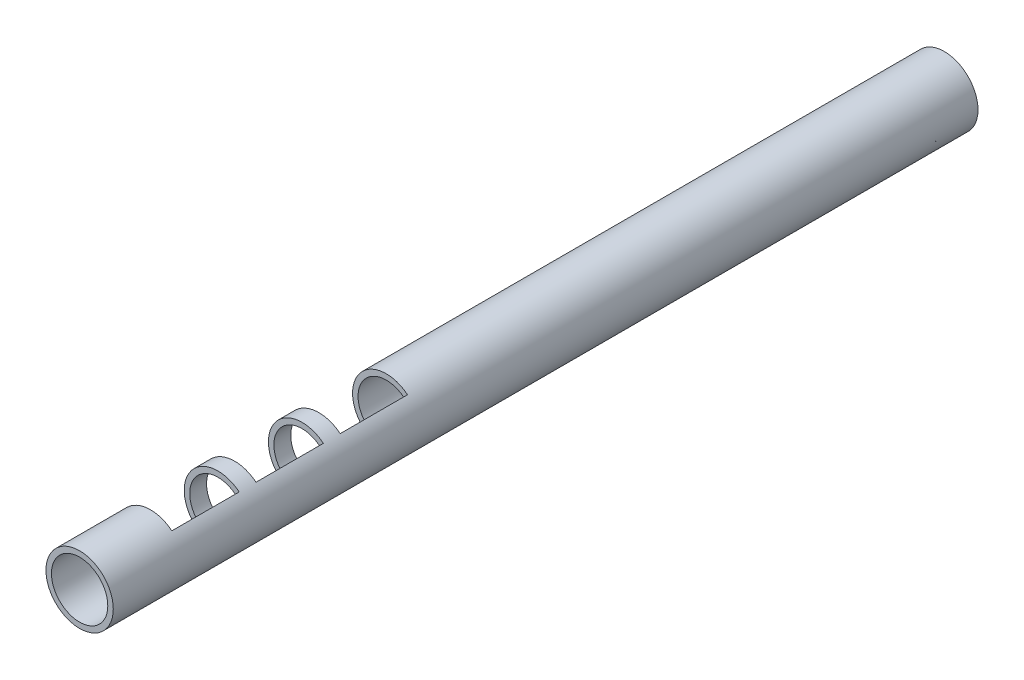
ISO-10303-21;
HEADER;
FILE_DESCRIPTION(('STEP AP214'),'2;1');
FILE_NAME('part.step','',(''),(''),'','','');
FILE_SCHEMA(('AUTOMOTIVE_DESIGN { 1 0 10303 214 1 1 1 1 }'));
ENDSEC;
DATA;
#1=APPLICATION_CONTEXT('core data for automotive mechanical design processes');
#2=APPLICATION_PROTOCOL_DEFINITION('international standard','automotive_design',2000,#1);
#3=PRODUCT_CONTEXT('',#1,'mechanical');
#4=PRODUCT('Part','Part','',(#3));
#5=PRODUCT_RELATED_PRODUCT_CATEGORY('part','',(#4));
#6=PRODUCT_DEFINITION_FORMATION('','',#4);
#7=PRODUCT_DEFINITION_CONTEXT('part definition',#1,'design');
#8=PRODUCT_DEFINITION('design','',#6,#7);
#9=PRODUCT_DEFINITION_SHAPE('','',#8);
#10=(LENGTH_UNIT() NAMED_UNIT(*) SI_UNIT(.MILLI.,.METRE.));
#11=(NAMED_UNIT(*) PLANE_ANGLE_UNIT() SI_UNIT($,.RADIAN.));
#12=(NAMED_UNIT(*) SI_UNIT($,.STERADIAN.) SOLID_ANGLE_UNIT());
#13=UNCERTAINTY_MEASURE_WITH_UNIT(LENGTH_MEASURE(1.E-05),#10,'distance_accuracy_value','');
#14=(GEOMETRIC_REPRESENTATION_CONTEXT(3) GLOBAL_UNCERTAINTY_ASSIGNED_CONTEXT((#13)) GLOBAL_UNIT_ASSIGNED_CONTEXT((#10,
#11,#12)) REPRESENTATION_CONTEXT('',''));
#15=CARTESIAN_POINT('',(0.,0.,0.));
#16=DIRECTION('',(0.,0.,1.));
#17=DIRECTION('',(1.,0.,0.));
#18=AXIS2_PLACEMENT_3D('',#15,#16,#17);
#19=CARTESIAN_POINT('',(0.393200000000001,0.481952030808046,2.488));
#20=DIRECTION('',(-0.774842493260524,0.632154340836013,0.));
#21=DIRECTION('',(0.,0.,1.));
#22=AXIS2_PLACEMENT_3D('',#19,#20,#21);
#23=PLANE('',#22);
#24=DIRECTION('',(0.632154340836013,0.774842493260524,0.));
#25=VECTOR('',#24,1.);
#26=CARTESIAN_POINT('',(0.393200000000001,0.481952030808046,1.866));
#27=LINE('',#26,#25);
#28=CARTESIAN_POINT('',(0.329108400000001,0.403393849786335,1.866));
#29=VERTEX_POINT('',#28);
#30=CARTESIAN_POINT('',(0.393200000000001,0.481952030808046,1.866));
#31=VERTEX_POINT('',#30);
#32=EDGE_CURVE('E11',#29,#31,#27,.T.);
#33=ORIENTED_EDGE('',*,*,#32,.F.);
#34=DIRECTION('',(0.,0.,1.));
#35=VECTOR('',#34,1.);
#36=CARTESIAN_POINT('',(0.329108400000001,0.403393849786335,1.555));
#37=LINE('',#36,#35);
#38=CARTESIAN_POINT('',(0.329108400000001,0.403393849786335,3.11));
#39=VERTEX_POINT('',#38);
#40=EDGE_CURVE('E296',#29,#39,#37,.T.);
#41=ORIENTED_EDGE('',*,*,#40,.T.);
#42=DIRECTION('',(0.632154340836013,0.774842493260524,0.));
#43=VECTOR('',#42,1.);
#44=CARTESIAN_POINT('',(0.393200000000001,0.481952030808046,3.11));
#45=LINE('',#44,#43);
#46=CARTESIAN_POINT('',(0.393200000000001,0.481952030808046,3.11));
#47=VERTEX_POINT('',#46);
#48=EDGE_CURVE('E51',#39,#47,#45,.T.);
#49=ORIENTED_EDGE('',*,*,#48,.T.);
#50=DIRECTION('',(0.,0.,1.));
#51=VECTOR('',#50,1.);
#52=CARTESIAN_POINT('',(0.393200000000001,0.481952030808046,1.555));
#53=LINE('',#52,#51);
#54=EDGE_CURVE('E286',#31,#47,#53,.T.);
#55=ORIENTED_EDGE('',*,*,#54,.F.);
#56=EDGE_LOOP('',(#33,#41,#49,#55));
#57=FACE_BOUND('',#56,.T.);
#58=ADVANCED_FACE('F43',(#57),#23,.T.);
#59=CARTESIAN_POINT('',(0.,0.,3.11));
#60=DIRECTION('',(0.,0.,1.));
#61=DIRECTION('',(1.,0.,0.));
#62=AXIS2_PLACEMENT_3D('',#59,#60,#61);
#63=PLANE('',#62);
#64=ORIENTED_EDGE('',*,*,#48,.F.);
#65=CARTESIAN_POINT('',(0.,0.,3.11));
#66=DIRECTION('',(0.,0.,1.));
#67=DIRECTION('',(1.,0.,0.));
#68=AXIS2_PLACEMENT_3D('',#65,#66,#67);
#69=CIRCLE('',#68,0.520614);
#70=CARTESIAN_POINT('',(0.329108400000001,-0.403393849786335,3.11));
#71=VERTEX_POINT('',#70);
#72=EDGE_CURVE('E293',#39,#71,#69,.T.);
#73=ORIENTED_EDGE('',*,*,#72,.T.);
#74=DIRECTION('',(0.632154340836013,-0.774842493260524,0.));
#75=VECTOR('',#74,1.);
#76=CARTESIAN_POINT('',(0.3932,-0.481952030808046,3.11));
#77=LINE('',#76,#75);
#78=CARTESIAN_POINT('',(0.3932,-0.481952030808046,3.11));
#79=VERTEX_POINT('',#78);
#80=EDGE_CURVE('E176',#71,#79,#77,.T.);
#81=ORIENTED_EDGE('',*,*,#80,.T.);
#82=CARTESIAN_POINT('',(0.,0.,3.11));
#83=DIRECTION('',(0.,0.,-1.));
#84=DIRECTION('',(-1.,0.,0.));
#85=AXIS2_PLACEMENT_3D('',#82,#83,#84);
#86=CIRCLE('',#85,0.622);
#87=EDGE_CURVE('E281',#47,#79,#86,.F.);
#88=ORIENTED_EDGE('',*,*,#87,.F.);
#89=EDGE_LOOP('',(#64,#73,#81,#88));
#90=FACE_BOUND('',#89,.T.);
#91=ADVANCED_FACE('F241',(#90),#63,.F.);
#92=CARTESIAN_POINT('',(0.,0.,3.421));
#93=DIRECTION('',(0.,0.,-1.));
#94=DIRECTION('',(-1.,0.,0.));
#95=AXIS2_PLACEMENT_3D('',#92,#93,#94);
#96=PLANE('',#95);
#97=DIRECTION('',(0.632154340836013,0.774842493260524,0.));
#98=VECTOR('',#97,1.);
#99=CARTESIAN_POINT('',(0.393200000000001,0.481952030808046,3.421));
#100=LINE('',#99,#98);
#101=CARTESIAN_POINT('',(0.329108400000001,0.403393849786335,3.421));
#102=VERTEX_POINT('',#101);
#103=CARTESIAN_POINT('',(0.393200000000001,0.481952030808046,3.421));
#104=VERTEX_POINT('',#103);
#105=EDGE_CURVE('E268',#102,#104,#100,.T.);
#106=ORIENTED_EDGE('',*,*,#105,.T.);
#107=CARTESIAN_POINT('',(0.,0.,3.421));
#108=DIRECTION('',(0.,0.,1.));
#109=DIRECTION('',(1.,0.,0.));
#110=AXIS2_PLACEMENT_3D('',#107,#108,#109);
#111=CIRCLE('',#110,0.622);
#112=CARTESIAN_POINT('',(0.393200000000001,-0.481952030808046,3.421));
#113=VERTEX_POINT('',#112);
#114=EDGE_CURVE('E282',#104,#113,#111,.T.);
#115=ORIENTED_EDGE('',*,*,#114,.T.);
#116=DIRECTION('',(0.632154340836013,-0.774842493260524,0.));
#117=VECTOR('',#116,1.);
#118=CARTESIAN_POINT('',(0.393200000000001,-0.481952030808046,3.421));
#119=LINE('',#118,#117);
#120=CARTESIAN_POINT('',(0.329108400000001,-0.403393849786335,3.421));
#121=VERTEX_POINT('',#120);
#122=EDGE_CURVE('E152',#121,#113,#119,.T.);
#123=ORIENTED_EDGE('',*,*,#122,.F.);
#124=CARTESIAN_POINT('',(0.,0.,3.421));
#125=DIRECTION('',(0.,0.,1.));
#126=DIRECTION('',(1.,0.,0.));
#127=AXIS2_PLACEMENT_3D('',#124,#125,#126);
#128=CIRCLE('',#127,0.520614);
#129=EDGE_CURVE('E279',#102,#121,#128,.T.);
#130=ORIENTED_EDGE('',*,*,#129,.F.);
#131=EDGE_LOOP('',(#106,#115,#123,#130));
#132=FACE_BOUND('',#131,.T.);
#133=ADVANCED_FACE('F246',(#132),#96,.F.);
#134=CARTESIAN_POINT('',(0.,0.,1.555));
#135=DIRECTION('',(0.,0.,-1.));
#136=DIRECTION('',(-1.,0.,0.));
#137=AXIS2_PLACEMENT_3D('',#134,#135,#136);
#138=PLANE('',#137);
#139=DIRECTION('',(0.632154340836013,0.774842493260524,0.));
#140=VECTOR('',#139,1.);
#141=CARTESIAN_POINT('',(0.3932,0.481952030808046,1.555));
#142=LINE('',#141,#140);
#143=CARTESIAN_POINT('',(0.3291084,0.403393849786335,1.555));
#144=VERTEX_POINT('',#143);
#145=CARTESIAN_POINT('',(0.3932,0.481952030808046,1.555));
#146=VERTEX_POINT('',#145);
#147=EDGE_CURVE('E255',#144,#146,#142,.T.);
#148=ORIENTED_EDGE('',*,*,#147,.F.);
#149=CARTESIAN_POINT('',(0.,0.,1.555));
#150=DIRECTION('',(0.,0.,1.));
#151=DIRECTION('',(1.,0.,0.));
#152=AXIS2_PLACEMENT_3D('',#149,#150,#151);
#153=CIRCLE('',#152,0.520614);
#154=CARTESIAN_POINT('',(0.3291084,-0.403393849786335,1.555));
#155=VERTEX_POINT('',#154);
#156=EDGE_CURVE('E257',#144,#155,#153,.T.);
#157=ORIENTED_EDGE('',*,*,#156,.T.);
#158=DIRECTION('',(0.632154340836013,-0.774842493260524,0.));
#159=VECTOR('',#158,1.);
#160=CARTESIAN_POINT('',(0.3932,-0.481952030808046,1.555));
#161=LINE('',#160,#159);
#162=CARTESIAN_POINT('',(0.3932,-0.481952030808046,1.555));
#163=VERTEX_POINT('',#162);
#164=EDGE_CURVE('E165',#155,#163,#161,.T.);
#165=ORIENTED_EDGE('',*,*,#164,.T.);
#166=CARTESIAN_POINT('',(0.,0.,1.555));
#167=DIRECTION('',(0.,0.,1.));
#168=DIRECTION('',(1.,0.,0.));
#169=AXIS2_PLACEMENT_3D('',#166,#167,#168);
#170=CIRCLE('',#169,0.622);
#171=EDGE_CURVE('E66',#146,#163,#170,.T.);
#172=ORIENTED_EDGE('',*,*,#171,.F.);
#173=EDGE_LOOP('',(#148,#157,#165,#172));
#174=FACE_BOUND('',#173,.T.);
#175=ADVANCED_FACE('F237',(#174),#138,.T.);
#176=CARTESIAN_POINT('',(0.,0.,1.866));
#177=DIRECTION('',(0.,0.,-1.));
#178=DIRECTION('',(-1.,0.,0.));
#179=AXIS2_PLACEMENT_3D('',#176,#177,#178);
#180=PLANE('',#179);
#181=CARTESIAN_POINT('',(0.,0.,1.866));
#182=DIRECTION('',(0.,0.,1.));
#183=DIRECTION('',(1.,0.,0.));
#184=AXIS2_PLACEMENT_3D('',#181,#182,#183);
#185=CIRCLE('',#184,0.520614);
#186=CARTESIAN_POINT('',(0.329108400000001,-0.403393849786335,1.866));
#187=VERTEX_POINT('',#186);
#188=EDGE_CURVE('E284',#187,#29,#185,.F.);
#189=ORIENTED_EDGE('',*,*,#188,.T.);
#190=ORIENTED_EDGE('',*,*,#32,.T.);
#191=CARTESIAN_POINT('',(0.,0.,1.866));
#192=DIRECTION('',(0.,0.,1.));
#193=DIRECTION('',(1.,0.,0.));
#194=AXIS2_PLACEMENT_3D('',#191,#192,#193);
#195=CIRCLE('',#194,0.622);
#196=CARTESIAN_POINT('',(0.3932,-0.481952030808046,1.866));
#197=VERTEX_POINT('',#196);
#198=EDGE_CURVE('E289',#197,#31,#195,.F.);
#199=ORIENTED_EDGE('',*,*,#198,.F.);
#200=DIRECTION('',(0.632154340836013,-0.774842493260524,0.));
#201=VECTOR('',#200,1.);
#202=CARTESIAN_POINT('',(0.3932,-0.481952030808046,1.866));
#203=LINE('',#202,#201);
#204=EDGE_CURVE('E181',#187,#197,#203,.T.);
#205=ORIENTED_EDGE('',*,*,#204,.F.);
#206=EDGE_LOOP('',(#189,#190,#199,#205));
#207=FACE_BOUND('',#206,.T.);
#208=ADVANCED_FACE('F45',(#207),#180,.F.);
#209=CARTESIAN_POINT('',(0.,0.,1.555));
#210=DIRECTION('',(0.,0.,1.));
#211=DIRECTION('',(1.,0.,0.));
#212=AXIS2_PLACEMENT_3D('',#209,#210,#211);
#213=CYLINDRICAL_SURFACE('',#212,0.622);
#214=CARTESIAN_POINT('',(-0.622,0.,5.365));
#215=CARTESIAN_POINT('',(-0.621999577929827,0.0109193633288384,5.36499939308507));
#216=CARTESIAN_POINT('',(-0.621709329938002,0.0218502270294628,5.36410161503432));
#217=CARTESIAN_POINT('',(-0.620578112855119,0.043402443202015,5.36054010866013));
#218=CARTESIAN_POINT('',(-0.619736207669612,0.0540232374685384,5.35787337854731));
#219=CARTESIAN_POINT('',(-0.617593869971351,0.0746246518911457,5.35087419082279));
#220=CARTESIAN_POINT('',(-0.61629445041236,0.0846066291781811,5.34654541114978));
#221=CARTESIAN_POINT('',(-0.613370888019472,0.103699386181399,5.33635803819557));
#222=CARTESIAN_POINT('',(-0.61174679129765,0.112810289340036,5.33049966211826));
#223=CARTESIAN_POINT('',(-0.608286102372987,0.130203719158426,5.31721765206123));
#224=CARTESIAN_POINT('',(-0.606444663928166,0.138453985198494,5.30975303528527));
#225=CARTESIAN_POINT('',(-0.602784240920798,0.153610144329198,5.29355730894605));
#226=CARTESIAN_POINT('',(-0.600965262165017,0.160515696300347,5.28482587900247));
#227=CARTESIAN_POINT('',(-0.597503530771228,0.172963818804697,5.26606209326497));
#228=CARTESIAN_POINT('',(-0.595866696764658,0.178465603211153,5.25600148309368));
#229=CARTESIAN_POINT('',(-0.59302745289626,0.187685596399211,5.23503670826931));
#230=CARTESIAN_POINT('',(-0.591824918677886,0.191404315840203,5.22413278617599));
#231=CARTESIAN_POINT('',(-0.590041030843826,0.196833859126492,5.20215455937567));
#232=CARTESIAN_POINT('',(-0.589441214579351,0.198604530142794,5.19109658086054));
#233=CARTESIAN_POINT('',(-0.588875945894283,0.200274737992444,5.16882547613999));
#234=CARTESIAN_POINT('',(-0.588910313539342,0.200174805564169,5.15761239484344));
#235=CARTESIAN_POINT('',(-0.589593281584499,0.198153311328795,5.13585096574481));
#236=CARTESIAN_POINT('',(-0.590215937903085,0.196308688318,5.12529451770902));
#237=CARTESIAN_POINT('',(-0.591963052928186,0.190975230611652,5.10464966713253));
#238=CARTESIAN_POINT('',(-0.593087570309906,0.187486203657547,5.09456131947219));
#239=CARTESIAN_POINT('',(-0.595731017518543,0.178910257031213,5.07495920845102));
#240=CARTESIAN_POINT('',(-0.597255714099061,0.173799725062295,5.06545658672679));
#241=CARTESIAN_POINT('',(-0.600525069528976,0.162142523518303,5.0474194725291));
#242=CARTESIAN_POINT('',(-0.602269776064023,0.155595542374402,5.0388851907008));
#243=CARTESIAN_POINT('',(-0.605885585651293,0.140878299077213,5.02259381155107));
#244=CARTESIAN_POINT('',(-0.607758727443434,0.132645000236177,5.01489400937032));
#245=CARTESIAN_POINT('',(-0.611347152244487,0.114977401877551,5.0009672538188));
#246=CARTESIAN_POINT('',(-0.613062366497891,0.105542583485076,4.9947409401126));
#247=CARTESIAN_POINT('',(-0.616161845004992,0.0856218640392364,4.98389576386483));
#248=CARTESIAN_POINT('',(-0.617542856982662,0.0751269410421367,4.97929251303983));
#249=CARTESIAN_POINT('',(-0.619792686366072,0.0534683769053928,4.9719420636265));
#250=CARTESIAN_POINT('',(-0.620662554643341,0.0423061601262106,4.96919105526121));
#251=CARTESIAN_POINT('',(-0.62148320570485,0.025868383558992,4.96661195013316));
#252=CARTESIAN_POINT('',(-0.621676438455422,0.020715991613797,4.966008193597));
#253=CARTESIAN_POINT('',(-0.621934936052818,0.0103765990587502,4.96520207383045));
#254=CARTESIAN_POINT('',(-0.62200020059546,0.00518959836666256,4.96499971155417));
#255=CARTESIAN_POINT('',(-0.621999577929833,-0.0109193633288352,4.96500060691491));
#256=CARTESIAN_POINT('',(-0.621709329938004,-0.0218502270294587,4.96589838496567));
#257=CARTESIAN_POINT('',(-0.620578112855117,-0.0434024432020111,4.96945989133987));
#258=CARTESIAN_POINT('',(-0.619736207669612,-0.0540232374685353,4.97212662145269));
#259=CARTESIAN_POINT('',(-0.617593869971351,-0.0746246518911438,4.97912580917721));
#260=CARTESIAN_POINT('',(-0.616294450412361,-0.0846066291781794,4.98345458885022));
#261=CARTESIAN_POINT('',(-0.613370888019472,-0.103699386181397,4.99364196180443));
#262=CARTESIAN_POINT('',(-0.611746791297651,-0.112810289340035,4.99950033788174));
#263=CARTESIAN_POINT('',(-0.608286102372988,-0.130203719158423,5.01278234793877));
#264=CARTESIAN_POINT('',(-0.606444663928166,-0.138453985198492,5.02024696471472));
#265=CARTESIAN_POINT('',(-0.602784240920798,-0.153610144329196,5.03644269105395));
#266=CARTESIAN_POINT('',(-0.600965262165017,-0.160515696300345,5.04517412099753));
#267=CARTESIAN_POINT('',(-0.597503530771229,-0.172963818804695,5.06393790673503));
#268=CARTESIAN_POINT('',(-0.595866696764659,-0.178465603211152,5.07399851690632));
#269=CARTESIAN_POINT('',(-0.59302745289626,-0.187685596399211,5.09496329173069));
#270=CARTESIAN_POINT('',(-0.591824918677886,-0.191404315840202,5.10586721382401));
#271=CARTESIAN_POINT('',(-0.590041030843827,-0.196833859126491,5.12784544062432));
#272=CARTESIAN_POINT('',(-0.589441214579351,-0.198604530142794,5.13890341913945));
#273=CARTESIAN_POINT('',(-0.588875945894283,-0.200274737992444,5.16117452386001));
#274=CARTESIAN_POINT('',(-0.588910313539342,-0.200174805564169,5.17238760515656));
#275=CARTESIAN_POINT('',(-0.589593281584499,-0.198153311328795,5.19414903425519));
#276=CARTESIAN_POINT('',(-0.590215937903085,-0.196308688318,5.20470548229097));
#277=CARTESIAN_POINT('',(-0.591963052928186,-0.190975230611653,5.22535033286746));
#278=CARTESIAN_POINT('',(-0.593087570309906,-0.187486203657547,5.2354386805278));
#279=CARTESIAN_POINT('',(-0.595731017518542,-0.178910257031214,5.25504079154898));
#280=CARTESIAN_POINT('',(-0.597255714099061,-0.173799725062295,5.26454341327321));
#281=CARTESIAN_POINT('',(-0.600525069528976,-0.162142523518304,5.2825805274709));
#282=CARTESIAN_POINT('',(-0.602269776064022,-0.155595542374403,5.29111480929919));
#283=CARTESIAN_POINT('',(-0.605885585651293,-0.140878299077215,5.30740618844893));
#284=CARTESIAN_POINT('',(-0.607758727443433,-0.132645000236179,5.31510599062967));
#285=CARTESIAN_POINT('',(-0.611347152244487,-0.114977401877553,5.3290327461812));
#286=CARTESIAN_POINT('',(-0.61306236649789,-0.105542583485078,5.3352590598874));
#287=CARTESIAN_POINT('',(-0.616161845004992,-0.0856218640392379,5.34610423613517));
#288=CARTESIAN_POINT('',(-0.617542856982662,-0.0751269410421379,5.35070748696017));
#289=CARTESIAN_POINT('',(-0.619792686366072,-0.0534683769053939,5.3580579363735));
#290=CARTESIAN_POINT('',(-0.62066255464334,-0.042306160126212,5.36080894473879));
#291=CARTESIAN_POINT('',(-0.62148320570485,-0.0258683835589934,5.36338804986684));
#292=CARTESIAN_POINT('',(-0.621676438455423,-0.0207159916137979,5.363991806403));
#293=CARTESIAN_POINT('',(-0.621934936052818,-0.0103765990587498,5.36479792616955));
#294=CARTESIAN_POINT('',(-0.622000200595457,-0.00518959836666111,5.36500028844582));
#295=CARTESIAN_POINT('',(-0.622,0.,5.365));
#296=B_SPLINE_CURVE_WITH_KNOTS('',3,(#214,#215,#216,#217,#218,#219,#220,#221,#222,#223,#224,
#225,#226,#227,#228,#229,#230,#231,#232,#233,#234,#235,#236,#237,#238,#239,#240,#241,#242,#243,
#244,#245,#246,#247,#248,#249,#250,#251,#252,#253,#254,#255,#256,#257,#258,#259,#260,#261,#262,
#263,#264,#265,#266,#267,#268,#269,#270,#271,#272,#273,#274,#275,#276,#277,#278,#279,#280,#281,
#282,#283,#284,#285,#286,#287,#288,#289,#290,#291,#292,#293,#294,#295),.UNSPECIFIED.,.T.,.F.,(4,
2,2,2,2,2,2,2,2,2,2,2,2,2,2,2,2,2,2,2,2,2,2,2,2,2,2,2,2,2,2,2,2,2,2,2,2,2,2,2,4),(0.,
0.0327380856553519,0.065531868183564,0.0982534959600799,0.130970479764623,0.16465009229773,
0.198338237386977,0.232915564706205,0.26748298335722,0.300955906343576,0.334419332343535,
0.366472648404575,0.398529712968828,0.431076848275395,0.463631050114923,0.497754520395143,
0.531892777149168,0.566350973681965,0.600738076718819,0.61629732746276,0.631856615191184,
0.664594700846535,0.697388483374749,0.730110111151266,0.762827094955808,0.796506707488914,
0.830194852578161,0.864772179897391,0.899339598548406,0.932812521534762,0.96627594753472,
0.998329263595761,1.03038632816001,1.06293346346658,1.09548766530611,1.12961113558633,
1.16374939234035,1.19820758887315,1.23259469191,1.24815394265395,1.26371323038237),.UNSPECIFIED.);
#297=CARTESIAN_POINT('',(-0.622,0.,5.365));
#298=VERTEX_POINT('',#297);
#299=EDGE_CURVE('E191',#298,#298,#296,.T.);
#300=ORIENTED_EDGE('',*,*,#299,.F.);
#301=EDGE_LOOP('',(#300));
#302=FACE_BOUND('',#301,.T.);
#303=DIRECTION('',(0.,0.,1.));
#304=VECTOR('',#303,1.);
#305=CARTESIAN_POINT('',(0.393200000000001,-0.481952030808046,3.11));
#306=LINE('',#305,#304);
#307=CARTESIAN_POINT('',(0.393200000000001,-0.481952030808046,4.665));
#308=VERTEX_POINT('',#307);
#309=EDGE_CURVE('E140',#113,#308,#306,.T.);
#310=ORIENTED_EDGE('',*,*,#309,.F.);
#311=ORIENTED_EDGE('',*,*,#114,.F.);
#312=DIRECTION('',(0.,0.,1.));
#313=VECTOR('',#312,1.);
#314=CARTESIAN_POINT('',(0.393200000000001,0.481952030808046,3.11));
#315=LINE('',#314,#313);
#316=CARTESIAN_POINT('',(0.393200000000001,0.481952030808046,4.665));
#317=VERTEX_POINT('',#316);
#318=EDGE_CURVE('E142',#104,#317,#315,.T.);
#319=ORIENTED_EDGE('',*,*,#318,.T.);
#320=CARTESIAN_POINT('',(0.,0.,4.665));
#321=DIRECTION('',(0.,0.,-1.));
#322=DIRECTION('',(-1.,0.,0.));
#323=AXIS2_PLACEMENT_3D('',#320,#321,#322);
#324=CIRCLE('',#323,0.622);
#325=EDGE_CURVE('E134',#317,#308,#324,.F.);
#326=ORIENTED_EDGE('',*,*,#325,.T.);
#327=EDGE_LOOP('',(#310,#311,#319,#326));
#328=FACE_BOUND('',#327,.T.);
#329=CARTESIAN_POINT('',(0.,0.,5.976));
#330=DIRECTION('',(0.,0.,1.));
#331=DIRECTION('',(1.,0.,0.));
#332=AXIS2_PLACEMENT_3D('',#329,#330,#331);
#333=CIRCLE('',#332,0.622);
#334=CARTESIAN_POINT('',(0.622,0.,5.976));
#335=VERTEX_POINT('',#334);
#336=EDGE_CURVE('E532',#335,#335,#333,.T.);
#337=ORIENTED_EDGE('',*,*,#336,.F.);
#338=EDGE_LOOP('',(#337));
#339=FACE_BOUND('',#338,.T.);
#340=DIRECTION('',(0.,0.,1.));
#341=VECTOR('',#340,1.);
#342=CARTESIAN_POINT('',(0.3932,-0.481952030808046,1.555));
#343=LINE('',#342,#341);
#344=EDGE_CURVE('E173',#197,#79,#343,.T.);
#345=ORIENTED_EDGE('',*,*,#344,.F.);
#346=ORIENTED_EDGE('',*,*,#198,.T.);
#347=ORIENTED_EDGE('',*,*,#54,.T.);
#348=ORIENTED_EDGE('',*,*,#87,.T.);
#349=EDGE_LOOP('',(#345,#346,#347,#348));
#350=FACE_BOUND('',#349,.T.);
#351=DIRECTION('',(0.,0.,1.));
#352=VECTOR('',#351,1.);
#353=CARTESIAN_POINT('',(0.3932,-0.481952030808046,0.));
#354=LINE('',#353,#352);
#355=CARTESIAN_POINT('',(0.3932,-0.481952030808046,0.311));
#356=VERTEX_POINT('',#355);
#357=EDGE_CURVE('E162',#356,#163,#354,.T.);
#358=ORIENTED_EDGE('',*,*,#357,.F.);
#359=CARTESIAN_POINT('',(0.,0.,0.311));
#360=DIRECTION('',(0.,0.,1.));
#361=DIRECTION('',(1.,0.,0.));
#362=AXIS2_PLACEMENT_3D('',#359,#360,#361);
#363=CIRCLE('',#362,0.622);
#364=CARTESIAN_POINT('',(0.3932,0.481952030808046,0.311));
#365=VERTEX_POINT('',#364);
#366=EDGE_CURVE('E261',#356,#365,#363,.F.);
#367=ORIENTED_EDGE('',*,*,#366,.T.);
#368=DIRECTION('',(0.,0.,1.));
#369=VECTOR('',#368,1.);
#370=CARTESIAN_POINT('',(0.3932,0.481952030808046,0.));
#371=LINE('',#370,#369);
#372=EDGE_CURVE('E270',#365,#146,#371,.T.);
#373=ORIENTED_EDGE('',*,*,#372,.T.);
#374=ORIENTED_EDGE('',*,*,#171,.T.);
#375=EDGE_LOOP('',(#358,#367,#373,#374));
#376=FACE_BOUND('',#375,.T.);
#377=CARTESIAN_POINT('',(0.,0.,-10.));
#378=DIRECTION('',(0.,0.,-1.));
#379=DIRECTION('',(-1.,0.,0.));
#380=AXIS2_PLACEMENT_3D('',#377,#378,#379);
#381=CIRCLE('',#380,0.622);
#382=CARTESIAN_POINT('',(-0.622,0.,-10.));
#383=VERTEX_POINT('',#382);
#384=EDGE_CURVE('E317',#383,#383,#381,.T.);
#385=ORIENTED_EDGE('',*,*,#384,.F.);
#386=EDGE_LOOP('',(#385));
#387=FACE_BOUND('',#386,.T.);
#388=ADVANCED_FACE('F136',(#302,#328,#339,#350,#376,#387),#213,.T.);
#389=CARTESIAN_POINT('',(0.,0.,1.555));
#390=DIRECTION('',(0.,0.,1.));
#391=DIRECTION('',(1.,0.,0.));
#392=AXIS2_PLACEMENT_3D('',#389,#390,#391);
#393=CYLINDRICAL_SURFACE('',#392,0.520614);
#394=CARTESIAN_POINT('',(-0.520614,0.,5.365));
#395=CARTESIAN_POINT('',(-0.520613514689114,0.0107956701120088,5.36499937381276));
#396=CARTESIAN_POINT('',(-0.520274634314804,0.0216012044258958,5.36412169078187));
#397=CARTESIAN_POINT('',(-0.518953603242681,0.0429001093390013,5.36064353234449));
#398=CARTESIAN_POINT('',(-0.517970491559685,0.0533929890741568,5.35804048318187));
#399=CARTESIAN_POINT('',(-0.515467170996156,0.073738227431799,5.35121886699427));
#400=CARTESIAN_POINT('',(-0.513948400366225,0.0835922184170895,5.34700462352429));
#401=CARTESIAN_POINT('',(-0.510524407794475,0.102448673096472,5.3370981675949));
#402=CARTESIAN_POINT('',(-0.508619200560733,0.111451169180001,5.33140601138369));
#403=CARTESIAN_POINT('',(-0.504523374923857,0.128752900072885,5.3184411156542));
#404=CARTESIAN_POINT('',(-0.502324385367266,0.137009567903274,5.31111423454273));
#405=CARTESIAN_POINT('',(-0.497928940551434,0.152211856034186,5.29520255463404));
#406=CARTESIAN_POINT('',(-0.495732486539278,0.159156987475636,5.2866172888989));
#407=CARTESIAN_POINT('',(-0.4914925845933,0.171815042363857,5.26801064474767));
#408=CARTESIAN_POINT('',(-0.489458890180966,0.177466918989746,5.2579452888811));
#409=CARTESIAN_POINT('',(-0.485905241196104,0.186978631328273,5.23691659564903));
#410=CARTESIAN_POINT('',(-0.484385069683624,0.190839224034607,5.22595363991631));
#411=CARTESIAN_POINT('',(-0.482120130764399,0.196489388722503,5.203930258725));
#412=CARTESIAN_POINT('',(-0.481345075675259,0.198360218476035,5.19289390331718));
#413=CARTESIAN_POINT('',(-0.480569780928279,0.200231751889377,5.17063878623134));
#414=CARTESIAN_POINT('',(-0.480569199721745,0.200233279925004,5.1594201071423));
#415=CARTESIAN_POINT('',(-0.481316904110774,0.198428100816448,5.13787534382539));
#416=CARTESIAN_POINT('',(-0.482017784666322,0.196735858737025,5.12753771324575));
#417=CARTESIAN_POINT('',(-0.484010379390151,0.191780980630058,5.10730628041781));
#418=CARTESIAN_POINT('',(-0.485302189169174,0.188518090471457,5.09741255027597));
#419=CARTESIAN_POINT('',(-0.488358502567815,0.180454276834374,5.07812245420864));
#420=CARTESIAN_POINT('',(-0.490131736000886,0.175624590747233,5.06873955628492));
#421=CARTESIAN_POINT('',(-0.493948271745926,0.164584589481138,5.05088526995001));
#422=CARTESIAN_POINT('',(-0.495991658494738,0.158373842233772,5.04241416803002));
#423=CARTESIAN_POINT('',(-0.500294452493576,0.144231468047008,5.02599345908577));
#424=CARTESIAN_POINT('',(-0.502558920556002,0.136209242537718,5.018123017015));
#425=CARTESIAN_POINT('',(-0.506925822119937,0.118930527519278,5.00381254534915));
#426=CARTESIAN_POINT('',(-0.509028179284183,0.109673462063507,4.99737318699076));
#427=CARTESIAN_POINT('',(-0.512879961730973,0.0899750494078043,4.98601390020554));
#428=CARTESIAN_POINT('',(-0.51462252956897,0.0795157371428972,4.98112268638634));
#429=CARTESIAN_POINT('',(-0.51750471262191,0.0578491298274882,4.97320339231079));
#430=CARTESIAN_POINT('',(-0.518645543355978,0.0466433945676833,4.97017155405159));
#431=CARTESIAN_POINT('',(-0.519813743081124,0.029441167770076,4.96709050817924));
#432=CARTESIAN_POINT('',(-0.520112792421215,0.0235854149281415,4.9663077511314));
#433=CARTESIAN_POINT('',(-0.520513053270645,0.0118207605769446,4.96526232687946));
#434=CARTESIAN_POINT('',(-0.520614265763031,0.00591185933192195,4.96499965709107));
#435=CARTESIAN_POINT('',(-0.520613514689164,-0.010795670111983,4.96500062618711));
#436=CARTESIAN_POINT('',(-0.520274634314819,-0.0216012044258642,4.96587830921809));
#437=CARTESIAN_POINT('',(-0.51895360324267,-0.0429001093389702,4.96935646765554));
#438=CARTESIAN_POINT('',(-0.517970491559684,-0.0533929890741318,4.97195951681814));
#439=CARTESIAN_POINT('',(-0.515467170996162,-0.0737382274317821,4.97878113300571));
#440=CARTESIAN_POINT('',(-0.513948400366228,-0.0835922184170746,4.9829953764757));
#441=CARTESIAN_POINT('',(-0.510524407794477,-0.102448673096457,4.99290183240509));
#442=CARTESIAN_POINT('',(-0.508619200560736,-0.111451169179985,4.9985939886163));
#443=CARTESIAN_POINT('',(-0.504523374923862,-0.128752900072867,5.01155888434579));
#444=CARTESIAN_POINT('',(-0.502324385367271,-0.137009567903256,5.01888576545725));
#445=CARTESIAN_POINT('',(-0.497928940551438,-0.15221185603417,5.03479744536594));
#446=CARTESIAN_POINT('',(-0.495732486539283,-0.159156987475622,5.04338271110108));
#447=CARTESIAN_POINT('',(-0.491492584593304,-0.171815042363845,5.06198935525231));
#448=CARTESIAN_POINT('',(-0.48945889018097,-0.177466918989735,5.07205471111888));
#449=CARTESIAN_POINT('',(-0.485905241196107,-0.186978631328265,5.09308340435095));
#450=CARTESIAN_POINT('',(-0.484385069683627,-0.1908392240346,5.10404636008366));
#451=CARTESIAN_POINT('',(-0.482120130764401,-0.196489388722499,5.12606974127498));
#452=CARTESIAN_POINT('',(-0.481345075675261,-0.198360218476032,5.1371060966828));
#453=CARTESIAN_POINT('',(-0.480569780928279,-0.200231751889377,5.15936121376863));
#454=CARTESIAN_POINT('',(-0.480569199721745,-0.200233279925005,5.17057989285767));
#455=CARTESIAN_POINT('',(-0.481316904110773,-0.198428100816451,5.19212465617458));
#456=CARTESIAN_POINT('',(-0.48201778466632,-0.196735858737029,5.20246228675423));
#457=CARTESIAN_POINT('',(-0.484010379390149,-0.191780980630064,5.22269371958216));
#458=CARTESIAN_POINT('',(-0.485302189169171,-0.188518090471464,5.23258744972401));
#459=CARTESIAN_POINT('',(-0.488358502567812,-0.180454276834382,5.25187754579134));
#460=CARTESIAN_POINT('',(-0.490131736000883,-0.175624590747242,5.26126044371506));
#461=CARTESIAN_POINT('',(-0.493948271745923,-0.164584589481149,5.27911473004997));
#462=CARTESIAN_POINT('',(-0.495991658494734,-0.158373842233784,5.28758583196996));
#463=CARTESIAN_POINT('',(-0.500294452493571,-0.144231468047023,5.30400654091421));
#464=CARTESIAN_POINT('',(-0.502558920555997,-0.136209242537736,5.31187698298498));
#465=CARTESIAN_POINT('',(-0.506925822119932,-0.118930527519299,5.32618745465084));
#466=CARTESIAN_POINT('',(-0.509028179284178,-0.109673462063528,5.33262681300923));
#467=CARTESIAN_POINT('',(-0.512879961730971,-0.0899750494078233,5.34398609979445));
#468=CARTESIAN_POINT('',(-0.514622529568969,-0.0795157371429141,5.34887731361366));
#469=CARTESIAN_POINT('',(-0.517504712621907,-0.0578491298275051,5.3567966076892));
#470=CARTESIAN_POINT('',(-0.518645543355971,-0.0466433945677026,5.35982844594839));
#471=CARTESIAN_POINT('',(-0.519813743081125,-0.0294411677700941,5.36290949182077));
#472=CARTESIAN_POINT('',(-0.520112792421223,-0.023585414928155,5.36369224886862));
#473=CARTESIAN_POINT('',(-0.520513053270637,-0.011820760576944,5.36473767312052));
#474=CARTESIAN_POINT('',(-0.520614265763001,-0.00591185933191171,5.36500034290886));
#475=CARTESIAN_POINT('',(-0.520614,0.,5.365));
#476=B_SPLINE_CURVE_WITH_KNOTS('',3,(#394,#395,#396,#397,#398,#399,#400,#401,#402,#403,#404,
#405,#406,#407,#408,#409,#410,#411,#412,#413,#414,#415,#416,#417,#418,#419,#420,#421,#422,#423,
#424,#425,#426,#427,#428,#429,#430,#431,#432,#433,#434,#435,#436,#437,#438,#439,#440,#441,#442,
#443,#444,#445,#446,#447,#448,#449,#450,#451,#452,#453,#454,#455,#456,#457,#458,#459,#460,#461,
#462,#463,#464,#465,#466,#467,#468,#469,#470,#471,#472,#473,#474,#475),.UNSPECIFIED.,.T.,.F.,(4,
2,2,2,2,2,2,2,2,2,2,2,2,2,2,2,2,2,2,2,2,2,2,2,2,2,2,2,2,2,2,2,2,2,2,2,2,2,2,2,4),(0.,
0.0323640931706411,0.064776573354208,0.0971026799981974,0.129427556516403,0.163046166797803,
0.196677283375778,0.231665785134983,0.266639487312473,0.300122540074218,0.333590826557912,
0.364940387240171,0.396295021991102,0.428261331555217,0.460237655964198,0.494473823824758,
0.528726016113178,0.563580615113041,0.598364534951794,0.616087651254464,0.633810679491186,
0.666174772661821,0.698587252845402,0.730913359489398,0.763238236007596,0.796856846288992,
0.83048796286697,0.865476464626175,0.900450166803664,0.93393321956541,0.967401506049105,
0.998751066731365,1.0301057014823,1.06207201104641,1.09404833545539,1.12828450331595,
1.16253669560437,1.19739129460424,1.23217521444299,1.24989833074567,1.26762135898242),.UNSPECIFIED.);
#477=CARTESIAN_POINT('',(-0.520614,0.,5.365));
#478=VERTEX_POINT('',#477);
#479=EDGE_CURVE('E184',#478,#478,#476,.T.);
#480=ORIENTED_EDGE('',*,*,#479,.T.);
#481=EDGE_LOOP('',(#480));
#482=FACE_BOUND('',#481,.T.);
#483=ORIENTED_EDGE('',*,*,#129,.T.);
#484=DIRECTION('',(0.,0.,1.));
#485=VECTOR('',#484,1.);
#486=CARTESIAN_POINT('',(0.329108400000001,-0.403393849786335,3.11));
#487=LINE('',#486,#485);
#488=CARTESIAN_POINT('',(0.329108400000001,-0.403393849786335,4.665));
#489=VERTEX_POINT('',#488);
#490=EDGE_CURVE('E156',#121,#489,#487,.T.);
#491=ORIENTED_EDGE('',*,*,#490,.T.);
#492=CARTESIAN_POINT('',(0.,0.,4.665));
#493=DIRECTION('',(0.,0.,1.));
#494=DIRECTION('',(1.,0.,0.));
#495=AXIS2_PLACEMENT_3D('',#492,#493,#494);
#496=CIRCLE('',#495,0.520614);
#497=CARTESIAN_POINT('',(0.329108400000001,0.403393849786335,4.665));
#498=VERTEX_POINT('',#497);
#499=EDGE_CURVE('E148',#498,#489,#496,.T.);
#500=ORIENTED_EDGE('',*,*,#499,.F.);
#501=DIRECTION('',(0.,0.,1.));
#502=VECTOR('',#501,1.);
#503=CARTESIAN_POINT('',(0.329108400000001,0.403393849786335,3.11));
#504=LINE('',#503,#502);
#505=EDGE_CURVE('E58',#102,#498,#504,.T.);
#506=ORIENTED_EDGE('',*,*,#505,.F.);
#507=EDGE_LOOP('',(#483,#491,#500,#506));
#508=FACE_BOUND('',#507,.T.);
#509=CARTESIAN_POINT('',(0.,0.,5.976));
#510=DIRECTION('',(0.,0.,-1.));
#511=DIRECTION('',(1.,0.,0.));
#512=AXIS2_PLACEMENT_3D('',#509,#510,#511);
#513=CIRCLE('',#512,0.520614);
#514=CARTESIAN_POINT('',(0.520614,0.,5.976));
#515=VERTEX_POINT('',#514);
#516=EDGE_CURVE('E321',#515,#515,#513,.T.);
#517=ORIENTED_EDGE('',*,*,#516,.F.);
#518=EDGE_LOOP('',(#517));
#519=FACE_BOUND('',#518,.T.);
#520=ORIENTED_EDGE('',*,*,#188,.F.);
#521=DIRECTION('',(0.,0.,1.));
#522=VECTOR('',#521,1.);
#523=CARTESIAN_POINT('',(0.329108400000001,-0.403393849786335,1.555));
#524=LINE('',#523,#522);
#525=EDGE_CURVE('E172',#187,#71,#524,.T.);
#526=ORIENTED_EDGE('',*,*,#525,.T.);
#527=ORIENTED_EDGE('',*,*,#72,.F.);
#528=ORIENTED_EDGE('',*,*,#40,.F.);
#529=EDGE_LOOP('',(#520,#526,#527,#528));
#530=FACE_BOUND('',#529,.T.);
#531=CARTESIAN_POINT('',(0.,0.,0.311));
#532=DIRECTION('',(0.,0.,1.));
#533=DIRECTION('',(1.,0.,0.));
#534=AXIS2_PLACEMENT_3D('',#531,#532,#533);
#535=CIRCLE('',#534,0.520614);
#536=CARTESIAN_POINT('',(0.3291084,-0.403393849786335,0.311));
#537=VERTEX_POINT('',#536);
#538=CARTESIAN_POINT('',(0.3291084,0.403393849786335,0.311));
#539=VERTEX_POINT('',#538);
#540=EDGE_CURVE('E267',#537,#539,#535,.F.);
#541=ORIENTED_EDGE('',*,*,#540,.F.);
#542=DIRECTION('',(0.,0.,1.));
#543=VECTOR('',#542,1.);
#544=CARTESIAN_POINT('',(0.3291084,-0.403393849786335,0.));
#545=LINE('',#544,#543);
#546=EDGE_CURVE('E161',#537,#155,#545,.T.);
#547=ORIENTED_EDGE('',*,*,#546,.T.);
#548=ORIENTED_EDGE('',*,*,#156,.F.);
#549=DIRECTION('',(0.,0.,1.));
#550=VECTOR('',#549,1.);
#551=CARTESIAN_POINT('',(0.3291084,0.403393849786335,0.));
#552=LINE('',#551,#550);
#553=EDGE_CURVE('E264',#539,#144,#552,.T.);
#554=ORIENTED_EDGE('',*,*,#553,.F.);
#555=EDGE_LOOP('',(#541,#547,#548,#554));
#556=FACE_BOUND('',#555,.T.);
#557=CARTESIAN_POINT('',(0.,0.,-10.));
#558=DIRECTION('',(0.,0.,1.));
#559=DIRECTION('',(-1.,0.,0.));
#560=AXIS2_PLACEMENT_3D('',#557,#558,#559);
#561=CIRCLE('',#560,0.520614);
#562=CARTESIAN_POINT('',(-0.520614,0.,-10.));
#563=VERTEX_POINT('',#562);
#564=EDGE_CURVE('E316',#563,#563,#561,.T.);
#565=ORIENTED_EDGE('',*,*,#564,.F.);
#566=EDGE_LOOP('',(#565));
#567=FACE_BOUND('',#566,.T.);
#568=ADVANCED_FACE('F196',(#482,#508,#519,#530,#556,#567),#393,.F.);
#569=CARTESIAN_POINT('',(0.3932,0.481952030808046,0.933));
#570=DIRECTION('',(-0.774842493260524,0.632154340836013,0.));
#571=DIRECTION('',(0.,0.,1.));
#572=AXIS2_PLACEMENT_3D('',#569,#570,#571);
#573=PLANE('',#572);
#574=DIRECTION('',(0.632154340836013,0.774842493260524,0.));
#575=VECTOR('',#574,1.);
#576=CARTESIAN_POINT('',(0.3932,0.481952030808046,0.311));
#577=LINE('',#576,#575);
#578=EDGE_CURVE('E260',#539,#365,#577,.T.);
#579=ORIENTED_EDGE('',*,*,#578,.F.);
#580=ORIENTED_EDGE('',*,*,#553,.T.);
#581=ORIENTED_EDGE('',*,*,#147,.T.);
#582=ORIENTED_EDGE('',*,*,#372,.F.);
#583=EDGE_LOOP('',(#579,#580,#581,#582));
#584=FACE_BOUND('',#583,.T.);
#585=ADVANCED_FACE('F223',(#584),#573,.T.);
#586=CARTESIAN_POINT('',(0.,0.,0.311));
#587=DIRECTION('',(0.,0.,-1.));
#588=DIRECTION('',(-1.,0.,0.));
#589=AXIS2_PLACEMENT_3D('',#586,#587,#588);
#590=PLANE('',#589);
#591=ORIENTED_EDGE('',*,*,#540,.T.);
#592=ORIENTED_EDGE('',*,*,#578,.T.);
#593=ORIENTED_EDGE('',*,*,#366,.F.);
#594=DIRECTION('',(0.632154340836013,-0.774842493260524,0.));
#595=VECTOR('',#594,1.);
#596=CARTESIAN_POINT('',(0.3932,-0.481952030808046,0.311));
#597=LINE('',#596,#595);
#598=EDGE_CURVE('E169',#537,#356,#597,.T.);
#599=ORIENTED_EDGE('',*,*,#598,.F.);
#600=EDGE_LOOP('',(#591,#592,#593,#599));
#601=FACE_BOUND('',#600,.T.);
#602=ADVANCED_FACE('F221',(#601),#590,.F.);
#603=CARTESIAN_POINT('',(0.393200000000001,0.481952030808046,4.043));
#604=DIRECTION('',(-0.774842493260524,0.632154340836013,0.));
#605=DIRECTION('',(0.,0.,1.));
#606=AXIS2_PLACEMENT_3D('',#603,#604,#605);
#607=PLANE('',#606);
#608=ORIENTED_EDGE('',*,*,#105,.F.);
#609=ORIENTED_EDGE('',*,*,#505,.T.);
#610=DIRECTION('',(0.632154340836013,0.774842493260524,0.));
#611=VECTOR('',#610,1.);
#612=CARTESIAN_POINT('',(0.393200000000001,0.481952030808046,4.665));
#613=LINE('',#612,#611);
#614=EDGE_CURVE('E273',#498,#317,#613,.T.);
#615=ORIENTED_EDGE('',*,*,#614,.T.);
#616=ORIENTED_EDGE('',*,*,#318,.F.);
#617=EDGE_LOOP('',(#608,#609,#615,#616));
#618=FACE_BOUND('',#617,.T.);
#619=ADVANCED_FACE('F218',(#618),#607,.T.);
#620=CARTESIAN_POINT('',(0.,0.,4.665));
#621=DIRECTION('',(0.,0.,1.));
#622=DIRECTION('',(1.,0.,0.));
#623=AXIS2_PLACEMENT_3D('',#620,#621,#622);
#624=PLANE('',#623);
#625=ORIENTED_EDGE('',*,*,#614,.F.);
#626=ORIENTED_EDGE('',*,*,#499,.T.);
#627=DIRECTION('',(0.632154340836013,-0.774842493260524,0.));
#628=VECTOR('',#627,1.);
#629=CARTESIAN_POINT('',(0.393200000000001,-0.481952030808046,4.665));
#630=LINE('',#629,#628);
#631=EDGE_CURVE('E146',#489,#308,#630,.T.);
#632=ORIENTED_EDGE('',*,*,#631,.T.);
#633=ORIENTED_EDGE('',*,*,#325,.F.);
#634=EDGE_LOOP('',(#625,#626,#632,#633));
#635=FACE_BOUND('',#634,.T.);
#636=ADVANCED_FACE('F147',(#635),#624,.F.);
#637=CARTESIAN_POINT('',(0.,0.,-10.));
#638=DIRECTION('',(0.,0.,-1.));
#639=DIRECTION('',(-1.,0.,0.));
#640=AXIS2_PLACEMENT_3D('',#637,#638,#639);
#641=PLANE('',#640);
#642=ORIENTED_EDGE('',*,*,#564,.T.);
#643=EDGE_LOOP('',(#642));
#644=FACE_BOUND('',#643,.T.);
#645=ORIENTED_EDGE('',*,*,#384,.T.);
#646=EDGE_LOOP('',(#645));
#647=FACE_BOUND('',#646,.T.);
#648=ADVANCED_FACE('F211',(#644,#647),#641,.T.);
#649=CARTESIAN_POINT('',(0.,0.,5.976));
#650=DIRECTION('',(0.,0.,1.));
#651=DIRECTION('',(1.,0.,0.));
#652=AXIS2_PLACEMENT_3D('',#649,#650,#651);
#653=PLANE('',#652);
#654=ORIENTED_EDGE('',*,*,#336,.T.);
#655=EDGE_LOOP('',(#654));
#656=FACE_BOUND('',#655,.T.);
#657=ORIENTED_EDGE('',*,*,#516,.T.);
#658=EDGE_LOOP('',(#657));
#659=FACE_BOUND('',#658,.T.);
#660=ADVANCED_FACE('F205',(#656,#659),#653,.T.);
#661=CARTESIAN_POINT('',(-0.622,0.,5.165));
#662=DIRECTION('',(1.,0.,0.));
#663=DIRECTION('',(0.,0.,-1.));
#664=AXIS2_PLACEMENT_3D('',#661,#662,#663);
#665=CYLINDRICAL_SURFACE('',#664,0.2);
#666=ORIENTED_EDGE('',*,*,#479,.F.);
#667=EDGE_LOOP('',(#666));
#668=FACE_BOUND('',#667,.T.);
#669=ORIENTED_EDGE('',*,*,#299,.T.);
#670=EDGE_LOOP('',(#669));
#671=FACE_BOUND('',#670,.T.);
#672=ADVANCED_FACE('F199',(#668,#671),#665,.F.);
#673=CARTESIAN_POINT('',(0.3932,-0.481952030808046,2.488));
#674=DIRECTION('',(-0.774842493260524,-0.632154340836013,0.));
#675=DIRECTION('',(0.,0.,1.));
#676=AXIS2_PLACEMENT_3D('',#673,#674,#675);
#677=PLANE('',#676);
#678=ORIENTED_EDGE('',*,*,#204,.T.);
#679=ORIENTED_EDGE('',*,*,#344,.T.);
#680=ORIENTED_EDGE('',*,*,#80,.F.);
#681=ORIENTED_EDGE('',*,*,#525,.F.);
#682=EDGE_LOOP('',(#678,#679,#680,#681));
#683=FACE_BOUND('',#682,.T.);
#684=ADVANCED_FACE('F204',(#683),#677,.T.);
#685=CARTESIAN_POINT('',(0.3932,-0.481952030808046,0.933));
#686=DIRECTION('',(-0.774842493260524,-0.632154340836013,0.));
#687=DIRECTION('',(0.,0.,1.));
#688=AXIS2_PLACEMENT_3D('',#685,#686,#687);
#689=PLANE('',#688);
#690=ORIENTED_EDGE('',*,*,#598,.T.);
#691=ORIENTED_EDGE('',*,*,#357,.T.);
#692=ORIENTED_EDGE('',*,*,#164,.F.);
#693=ORIENTED_EDGE('',*,*,#546,.F.);
#694=EDGE_LOOP('',(#690,#691,#692,#693));
#695=FACE_BOUND('',#694,.T.);
#696=ADVANCED_FACE('F332',(#695),#689,.T.);
#697=CARTESIAN_POINT('',(0.393200000000001,-0.481952030808046,4.043));
#698=DIRECTION('',(-0.774842493260524,-0.632154340836013,0.));
#699=DIRECTION('',(0.,0.,1.));
#700=AXIS2_PLACEMENT_3D('',#697,#698,#699);
#701=PLANE('',#700);
#702=ORIENTED_EDGE('',*,*,#122,.T.);
#703=ORIENTED_EDGE('',*,*,#309,.T.);
#704=ORIENTED_EDGE('',*,*,#631,.F.);
#705=ORIENTED_EDGE('',*,*,#490,.F.);
#706=EDGE_LOOP('',(#702,#703,#704,#705));
#707=FACE_BOUND('',#706,.T.);
#708=ADVANCED_FACE('F154',(#707),#701,.T.);
#709=CLOSED_SHELL('',(#58,#91,#133,#175,#208,#388,#568,#585,#602,#619,#636,#648,#660,#672,#684,
#696,#708));
#710=MANIFOLD_SOLID_BREP('B2',#709);
#711=ADVANCED_BREP_SHAPE_REPRESENTATION('',(#18,#710),#14);
#712=SHAPE_DEFINITION_REPRESENTATION(#9,#711);
ENDSEC;
END-ISO-10303-21;
